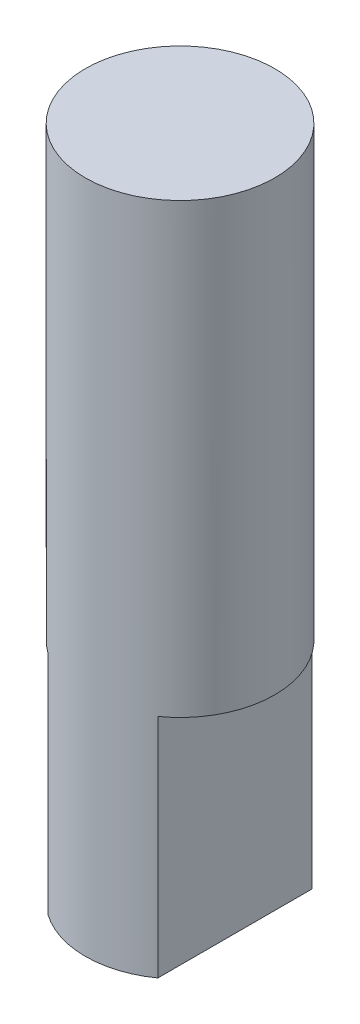
ISO-10303-21;
HEADER;
FILE_DESCRIPTION(('STEP AP214'),'2;1');
FILE_NAME('part.step','',(''),(''),'','','');
FILE_SCHEMA(('AUTOMOTIVE_DESIGN { 1 0 10303 214 1 1 1 1 }'));
ENDSEC;
DATA;
#1=APPLICATION_CONTEXT('core data for automotive mechanical design processes');
#2=APPLICATION_PROTOCOL_DEFINITION('international standard','automotive_design',2000,#1);
#3=PRODUCT_CONTEXT('',#1,'mechanical');
#4=PRODUCT('Part','Part','',(#3));
#5=PRODUCT_RELATED_PRODUCT_CATEGORY('part','',(#4));
#6=PRODUCT_DEFINITION_FORMATION('','',#4);
#7=PRODUCT_DEFINITION_CONTEXT('part definition',#1,'design');
#8=PRODUCT_DEFINITION('design','',#6,#7);
#9=PRODUCT_DEFINITION_SHAPE('','',#8);
#10=(LENGTH_UNIT() NAMED_UNIT(*) SI_UNIT(.MILLI.,.METRE.));
#11=(NAMED_UNIT(*) PLANE_ANGLE_UNIT() SI_UNIT($,.RADIAN.));
#12=(NAMED_UNIT(*) SI_UNIT($,.STERADIAN.) SOLID_ANGLE_UNIT());
#13=UNCERTAINTY_MEASURE_WITH_UNIT(LENGTH_MEASURE(1.E-05),#10,'distance_accuracy_value','');
#14=(GEOMETRIC_REPRESENTATION_CONTEXT(3) GLOBAL_UNCERTAINTY_ASSIGNED_CONTEXT((#13)) GLOBAL_UNIT_ASSIGNED_CONTEXT((#10,
#11,#12)) REPRESENTATION_CONTEXT('',''));
#15=CARTESIAN_POINT('',(0.,0.,0.));
#16=DIRECTION('',(0.,0.,1.));
#17=DIRECTION('',(1.,0.,0.));
#18=AXIS2_PLACEMENT_3D('',#15,#16,#17);
#19=CARTESIAN_POINT('',(0.,0.2,0.));
#20=DIRECTION('',(0.,-1.,0.));
#21=DIRECTION('',(0.,0.,-1.));
#22=AXIS2_PLACEMENT_3D('',#19,#20,#21);
#23=PLANE('',#22);
#24=CARTESIAN_POINT('',(0.,0.2,0.));
#25=DIRECTION('',(0.,1.,0.));
#26=DIRECTION('',(0.,0.,1.));
#27=AXIS2_PLACEMENT_3D('',#24,#25,#26);
#28=CIRCLE('',#27,0.25);
#29=CARTESIAN_POINT('',(0.,0.2,0.25));
#30=VERTEX_POINT('',#29);
#31=EDGE_CURVE('E19',#30,#30,#28,.T.);
#32=ORIENTED_EDGE('',*,*,#31,.F.);
#33=EDGE_LOOP('',(#32));
#34=FACE_BOUND('',#33,.T.);
#35=ADVANCED_FACE('F16',(#34),#23,.T.);
#36=CARTESIAN_POINT('',(0.,0.2,0.));
#37=DIRECTION('',(0.,1.,0.));
#38=DIRECTION('',(0.,0.,1.));
#39=AXIS2_PLACEMENT_3D('',#36,#37,#38);
#40=TOROIDAL_SURFACE('',#39,0.45,0.2);
#41=ORIENTED_EDGE('',*,*,#31,.T.);
#42=EDGE_LOOP('',(#41));
#43=FACE_BOUND('',#42,.T.);
#44=CARTESIAN_POINT('',(0.,0.,0.));
#45=DIRECTION('',(0.,-1.,0.));
#46=DIRECTION('',(-1.,0.,0.));
#47=AXIS2_PLACEMENT_3D('',#44,#45,#46);
#48=CIRCLE('',#47,0.45);
#49=CARTESIAN_POINT('',(-0.45,0.,0.));
#50=VERTEX_POINT('',#49);
#51=CARTESIAN_POINT('',(0.,0.,-0.45));
#52=VERTEX_POINT('',#51);
#53=EDGE_CURVE('E153',#50,#52,#48,.T.);
#54=ORIENTED_EDGE('',*,*,#53,.T.);
#55=CARTESIAN_POINT('',(0.,0.,0.));
#56=DIRECTION('',(0.,-1.,0.));
#57=DIRECTION('',(0.,0.,-1.));
#58=AXIS2_PLACEMENT_3D('',#55,#56,#57);
#59=CIRCLE('',#58,0.45);
#60=EDGE_CURVE('E67',#52,#50,#59,.T.);
#61=ORIENTED_EDGE('',*,*,#60,.T.);
#62=EDGE_LOOP('',(#54,#61));
#63=FACE_BOUND('',#62,.T.);
#64=ADVANCED_FACE('F133',(#43,#63),#40,.T.);
#65=CARTESIAN_POINT('',(0.,17.8,0.));
#66=DIRECTION('',(0.,1.,0.));
#67=DIRECTION('',(0.,0.,1.));
#68=AXIS2_PLACEMENT_3D('',#65,#66,#67);
#69=PLANE('',#68);
#70=CARTESIAN_POINT('',(0.,17.8,0.));
#71=DIRECTION('',(0.,1.,0.));
#72=DIRECTION('',(0.,0.,1.));
#73=AXIS2_PLACEMENT_3D('',#70,#71,#72);
#74=CIRCLE('',#73,2.5);
#75=CARTESIAN_POINT('',(0.,17.8,2.5));
#76=VERTEX_POINT('',#75);
#77=EDGE_CURVE('E87',#76,#76,#74,.F.);
#78=ORIENTED_EDGE('',*,*,#77,.F.);
#79=EDGE_LOOP('',(#78));
#80=FACE_BOUND('',#79,.T.);
#81=ADVANCED_FACE('F137',(#80),#69,.T.);
#82=CARTESIAN_POINT('',(1.975,5.98,0.));
#83=DIRECTION('',(0.,-1.,0.));
#84=DIRECTION('',(0.,0.,-1.));
#85=AXIS2_PLACEMENT_3D('',#82,#83,#84);
#86=PLANE('',#85);
#87=CARTESIAN_POINT('',(0.,5.98,0.));
#88=DIRECTION('',(0.,1.,0.));
#89=DIRECTION('',(0.,0.,1.));
#90=AXIS2_PLACEMENT_3D('',#87,#88,#89);
#91=CIRCLE('',#90,2.5);
#92=CARTESIAN_POINT('',(1.45,5.98,2.03654118544163));
#93=VERTEX_POINT('',#92);
#94=CARTESIAN_POINT('',(1.45,5.98,-2.03654118544163));
#95=VERTEX_POINT('',#94);
#96=EDGE_CURVE('E76',#93,#95,#91,.T.);
#97=ORIENTED_EDGE('',*,*,#96,.F.);
#98=DIRECTION('',(0.,0.,1.));
#99=VECTOR('',#98,1.);
#100=CARTESIAN_POINT('',(1.45,5.98,-2.03654118544163));
#101=LINE('',#100,#99);
#102=EDGE_CURVE('E68',#93,#95,#101,.F.);
#103=ORIENTED_EDGE('',*,*,#102,.T.);
#104=EDGE_LOOP('',(#97,#103));
#105=FACE_BOUND('',#104,.T.);
#106=ADVANCED_FACE('F175',(#105),#86,.T.);
#107=CARTESIAN_POINT('',(1.45,0.,-2.03654118544163));
#108=DIRECTION('',(-1.,0.,0.));
#109=DIRECTION('',(0.,0.,1.));
#110=AXIS2_PLACEMENT_3D('',#107,#108,#109);
#111=PLANE('',#110);
#112=DIRECTION('',(0.,1.,0.));
#113=VECTOR('',#112,1.);
#114=CARTESIAN_POINT('',(1.45,0.,-2.03654118544163));
#115=LINE('',#114,#113);
#116=CARTESIAN_POINT('',(1.45,0.,-2.03654118544163));
#117=VERTEX_POINT('',#116);
#118=EDGE_CURVE('E127',#95,#117,#115,.F.);
#119=ORIENTED_EDGE('',*,*,#118,.F.);
#120=ORIENTED_EDGE('',*,*,#102,.F.);
#121=DIRECTION('',(0.,1.,0.));
#122=VECTOR('',#121,1.);
#123=CARTESIAN_POINT('',(1.45,0.,2.03654118544163));
#124=LINE('',#123,#122);
#125=CARTESIAN_POINT('',(1.45,0.,2.03654118544163));
#126=VERTEX_POINT('',#125);
#127=EDGE_CURVE('E71',#126,#93,#124,.T.);
#128=ORIENTED_EDGE('',*,*,#127,.F.);
#129=DIRECTION('',(0.,0.,1.));
#130=VECTOR('',#129,1.);
#131=CARTESIAN_POINT('',(1.45,0.,0.));
#132=LINE('',#131,#130);
#133=EDGE_CURVE('E57',#126,#117,#132,.F.);
#134=ORIENTED_EDGE('',*,*,#133,.T.);
#135=EDGE_LOOP('',(#119,#120,#128,#134));
#136=FACE_BOUND('',#135,.T.);
#137=ADVANCED_FACE('F72',(#136),#111,.F.);
#138=CARTESIAN_POINT('',(0.,0.,0.));
#139=DIRECTION('',(0.,1.,0.));
#140=DIRECTION('',(0.,0.,1.));
#141=AXIS2_PLACEMENT_3D('',#138,#139,#140);
#142=PLANE('',#141);
#143=ORIENTED_EDGE('',*,*,#60,.F.);
#144=ORIENTED_EDGE('',*,*,#53,.F.);
#145=EDGE_LOOP('',(#143,#144));
#146=FACE_BOUND('',#145,.T.);
#147=CARTESIAN_POINT('',(0.,0.,0.));
#148=DIRECTION('',(0.,1.,0.));
#149=DIRECTION('',(0.,0.,1.));
#150=AXIS2_PLACEMENT_3D('',#147,#148,#149);
#151=CIRCLE('',#150,2.5);
#152=CARTESIAN_POINT('',(-1.45,0.,2.03654118544163));
#153=VERTEX_POINT('',#152);
#154=EDGE_CURVE('E61',#153,#126,#151,.T.);
#155=ORIENTED_EDGE('',*,*,#154,.F.);
#156=DIRECTION('',(0.,0.,-1.));
#157=VECTOR('',#156,1.);
#158=CARTESIAN_POINT('',(-1.45,0.,2.03654118544163));
#159=LINE('',#158,#157);
#160=CARTESIAN_POINT('',(-1.45,0.,-2.03654118544163));
#161=VERTEX_POINT('',#160);
#162=EDGE_CURVE('E91',#153,#161,#159,.T.);
#163=ORIENTED_EDGE('',*,*,#162,.T.);
#164=CARTESIAN_POINT('',(0.,0.,0.));
#165=DIRECTION('',(0.,1.,0.));
#166=DIRECTION('',(0.,0.,1.));
#167=AXIS2_PLACEMENT_3D('',#164,#165,#166);
#168=CIRCLE('',#167,2.5);
#169=EDGE_CURVE('E25',#117,#161,#168,.T.);
#170=ORIENTED_EDGE('',*,*,#169,.F.);
#171=ORIENTED_EDGE('',*,*,#133,.F.);
#172=EDGE_LOOP('',(#155,#163,#170,#171));
#173=FACE_BOUND('',#172,.T.);
#174=ADVANCED_FACE('F59',(#146,#173),#142,.F.);
#175=CARTESIAN_POINT('',(-1.45,0.,2.03654118544163));
#176=DIRECTION('',(1.,0.,0.));
#177=DIRECTION('',(0.,0.,-1.));
#178=AXIS2_PLACEMENT_3D('',#175,#176,#177);
#179=PLANE('',#178);
#180=DIRECTION('',(0.,1.,0.));
#181=VECTOR('',#180,1.);
#182=CARTESIAN_POINT('',(-1.45,0.,2.03654118544163));
#183=LINE('',#182,#181);
#184=CARTESIAN_POINT('',(-1.45,5.98,2.03654118544163));
#185=VERTEX_POINT('',#184);
#186=EDGE_CURVE('E81',#185,#153,#183,.F.);
#187=ORIENTED_EDGE('',*,*,#186,.F.);
#188=DIRECTION('',(0.,0.,-1.));
#189=VECTOR('',#188,1.);
#190=CARTESIAN_POINT('',(-1.45,5.98,0.));
#191=LINE('',#190,#189);
#192=CARTESIAN_POINT('',(-1.45,5.98,-2.03654118544163));
#193=VERTEX_POINT('',#192);
#194=EDGE_CURVE('E89',#193,#185,#191,.F.);
#195=ORIENTED_EDGE('',*,*,#194,.F.);
#196=DIRECTION('',(0.,1.,0.));
#197=VECTOR('',#196,1.);
#198=CARTESIAN_POINT('',(-1.45,0.,-2.03654118544163));
#199=LINE('',#198,#197);
#200=EDGE_CURVE('E11',#161,#193,#199,.T.);
#201=ORIENTED_EDGE('',*,*,#200,.F.);
#202=ORIENTED_EDGE('',*,*,#162,.F.);
#203=EDGE_LOOP('',(#187,#195,#201,#202));
#204=FACE_BOUND('',#203,.T.);
#205=ADVANCED_FACE('F115',(#204),#179,.F.);
#206=CARTESIAN_POINT('',(-1.975,5.98,0.));
#207=DIRECTION('',(0.,-1.,0.));
#208=DIRECTION('',(0.,0.,-1.));
#209=AXIS2_PLACEMENT_3D('',#206,#207,#208);
#210=PLANE('',#209);
#211=ORIENTED_EDGE('',*,*,#194,.T.);
#212=CARTESIAN_POINT('',(0.,5.98,0.));
#213=DIRECTION('',(0.,1.,0.));
#214=DIRECTION('',(0.,0.,1.));
#215=AXIS2_PLACEMENT_3D('',#212,#213,#214);
#216=CIRCLE('',#215,2.5);
#217=EDGE_CURVE('E33',#193,#185,#216,.T.);
#218=ORIENTED_EDGE('',*,*,#217,.F.);
#219=EDGE_LOOP('',(#211,#218));
#220=FACE_BOUND('',#219,.T.);
#221=ADVANCED_FACE('F162',(#220),#210,.T.);
#222=CARTESIAN_POINT('',(0.,0.,0.));
#223=DIRECTION('',(0.,1.,0.));
#224=DIRECTION('',(0.,0.,1.));
#225=AXIS2_PLACEMENT_3D('',#222,#223,#224);
#226=CYLINDRICAL_SURFACE('',#225,2.5);
#227=ORIENTED_EDGE('',*,*,#200,.T.);
#228=ORIENTED_EDGE('',*,*,#217,.T.);
#229=ORIENTED_EDGE('',*,*,#186,.T.);
#230=ORIENTED_EDGE('',*,*,#154,.T.);
#231=ORIENTED_EDGE('',*,*,#127,.T.);
#232=ORIENTED_EDGE('',*,*,#96,.T.);
#233=ORIENTED_EDGE('',*,*,#118,.T.);
#234=ORIENTED_EDGE('',*,*,#169,.T.);
#235=EDGE_LOOP('',(#227,#228,#229,#230,#231,#232,#233,#234));
#236=FACE_BOUND('',#235,.T.);
#237=ORIENTED_EDGE('',*,*,#77,.T.);
#238=EDGE_LOOP('',(#237));
#239=FACE_BOUND('',#238,.T.);
#240=ADVANCED_FACE('F78',(#236,#239),#226,.T.);
#241=CLOSED_SHELL('',(#35,#64,#81,#106,#137,#174,#205,#221,#240));
#242=MANIFOLD_SOLID_BREP('B1',#241);
#243=ADVANCED_BREP_SHAPE_REPRESENTATION('',(#18,#242),#14);
#244=SHAPE_DEFINITION_REPRESENTATION(#9,#243);
ENDSEC;
END-ISO-10303-21;
